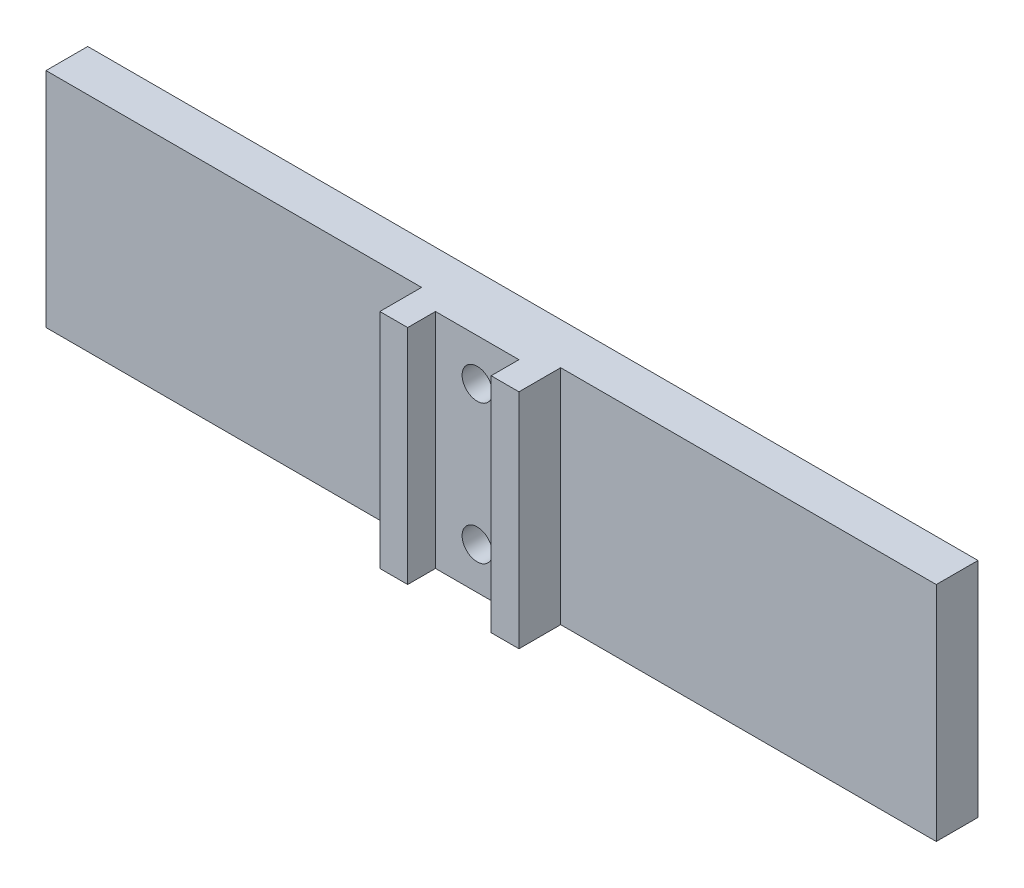
ISO-10303-21;
HEADER;
FILE_DESCRIPTION(('STEP AP214'),'2;1');
FILE_NAME('part.step','',(''),(''),'','','');
FILE_SCHEMA(('AUTOMOTIVE_DESIGN { 1 0 10303 214 1 1 1 1 }'));
ENDSEC;
DATA;
#1=APPLICATION_CONTEXT('core data for automotive mechanical design processes');
#2=APPLICATION_PROTOCOL_DEFINITION('international standard','automotive_design',2000,#1);
#3=PRODUCT_CONTEXT('',#1,'mechanical');
#4=PRODUCT('Part','Part','',(#3));
#5=PRODUCT_RELATED_PRODUCT_CATEGORY('part','',(#4));
#6=PRODUCT_DEFINITION_FORMATION('','',#4);
#7=PRODUCT_DEFINITION_CONTEXT('part definition',#1,'design');
#8=PRODUCT_DEFINITION('design','',#6,#7);
#9=PRODUCT_DEFINITION_SHAPE('','',#8);
#10=(LENGTH_UNIT() NAMED_UNIT(*) SI_UNIT(.MILLI.,.METRE.));
#11=(NAMED_UNIT(*) PLANE_ANGLE_UNIT() SI_UNIT($,.RADIAN.));
#12=(NAMED_UNIT(*) SI_UNIT($,.STERADIAN.) SOLID_ANGLE_UNIT());
#13=UNCERTAINTY_MEASURE_WITH_UNIT(LENGTH_MEASURE(1.E-05),#10,'distance_accuracy_value','');
#14=(GEOMETRIC_REPRESENTATION_CONTEXT(3) GLOBAL_UNCERTAINTY_ASSIGNED_CONTEXT((#13)) GLOBAL_UNIT_ASSIGNED_CONTEXT((#10,
#11,#12)) REPRESENTATION_CONTEXT('',''));
#15=CARTESIAN_POINT('',(0.,0.,0.));
#16=DIRECTION('',(0.,0.,1.));
#17=DIRECTION('',(1.,0.,0.));
#18=AXIS2_PLACEMENT_3D('',#15,#16,#17);
#19=CARTESIAN_POINT('',(0.,0.,9.525));
#20=DIRECTION('',(0.,0.,-1.));
#21=DIRECTION('',(-1.,0.,0.));
#22=AXIS2_PLACEMENT_3D('',#19,#20,#21);
#23=PLANE('',#22);
#24=DIRECTION('',(1.,0.,0.));
#25=VECTOR('',#24,1.);
#26=CARTESIAN_POINT('',(0.,0.,9.525));
#27=LINE('',#26,#25);
#28=CARTESIAN_POINT('',(42.8625,0.,9.525));
#29=VERTEX_POINT('',#28);
#30=CARTESIAN_POINT('',(46.0375,0.,9.52499999999999));
#31=VERTEX_POINT('',#30);
#32=EDGE_CURVE('E165',#29,#31,#27,.T.);
#33=ORIENTED_EDGE('',*,*,#32,.T.);
#34=DIRECTION('',(0.,1.,0.));
#35=VECTOR('',#34,1.);
#36=CARTESIAN_POINT('',(46.0375,0.,9.52499999999999));
#37=LINE('',#36,#35);
#38=CARTESIAN_POINT('',(46.0375,25.4,9.52499999999999));
#39=VERTEX_POINT('',#38);
#40=EDGE_CURVE('E187',#31,#39,#37,.T.);
#41=ORIENTED_EDGE('',*,*,#40,.T.);
#42=DIRECTION('',(-1.,0.,0.));
#43=VECTOR('',#42,1.);
#44=CARTESIAN_POINT('',(0.,25.4,9.525));
#45=LINE('',#44,#43);
#46=CARTESIAN_POINT('',(42.8625,25.4,9.525));
#47=VERTEX_POINT('',#46);
#48=EDGE_CURVE('E164',#39,#47,#45,.T.);
#49=ORIENTED_EDGE('',*,*,#48,.T.);
#50=DIRECTION('',(0.,1.,0.));
#51=VECTOR('',#50,1.);
#52=CARTESIAN_POINT('',(42.8625,0.,9.525));
#53=LINE('',#52,#51);
#54=EDGE_CURVE('E168',#29,#47,#53,.T.);
#55=ORIENTED_EDGE('',*,*,#54,.F.);
#56=EDGE_LOOP('',(#33,#41,#49,#55));
#57=FACE_BOUND('',#56,.T.);
#58=ADVANCED_FACE('F35',(#57),#23,.F.);
#59=CARTESIAN_POINT('',(0.,0.,9.525));
#60=DIRECTION('',(1.,0.,0.));
#61=DIRECTION('',(0.,0.,-1.));
#62=AXIS2_PLACEMENT_3D('',#59,#60,#61);
#63=PLANE('',#62);
#64=DIRECTION('',(0.,0.,-1.));
#65=VECTOR('',#64,1.);
#66=CARTESIAN_POINT('',(0.,0.,9.525));
#67=LINE('',#66,#65);
#68=CARTESIAN_POINT('',(0.,0.,4.76250000000001));
#69=VERTEX_POINT('',#68);
#70=CARTESIAN_POINT('',(0.,0.,0.));
#71=VERTEX_POINT('',#70);
#72=EDGE_CURVE('E11',#69,#71,#67,.T.);
#73=ORIENTED_EDGE('',*,*,#72,.F.);
#74=DIRECTION('',(0.,1.,0.));
#75=VECTOR('',#74,1.);
#76=CARTESIAN_POINT('',(0.,0.,4.76250000000001));
#77=LINE('',#76,#75);
#78=CARTESIAN_POINT('',(0.,25.4,4.76250000000001));
#79=VERTEX_POINT('',#78);
#80=EDGE_CURVE('E162',#69,#79,#77,.T.);
#81=ORIENTED_EDGE('',*,*,#80,.T.);
#82=DIRECTION('',(0.,0.,-1.));
#83=VECTOR('',#82,1.);
#84=CARTESIAN_POINT('',(0.,25.4,9.525));
#85=LINE('',#84,#83);
#86=CARTESIAN_POINT('',(0.,25.4,0.));
#87=VERTEX_POINT('',#86);
#88=EDGE_CURVE('E147',#79,#87,#85,.T.);
#89=ORIENTED_EDGE('',*,*,#88,.T.);
#90=DIRECTION('',(0.,-1.,0.));
#91=VECTOR('',#90,1.);
#92=CARTESIAN_POINT('',(0.,0.,0.));
#93=LINE('',#92,#91);
#94=EDGE_CURVE('E159',#87,#71,#93,.T.);
#95=ORIENTED_EDGE('',*,*,#94,.T.);
#96=EDGE_LOOP('',(#73,#81,#89,#95));
#97=FACE_BOUND('',#96,.T.);
#98=ADVANCED_FACE('F37',(#97),#63,.F.);
#99=CARTESIAN_POINT('',(0.,0.,9.525));
#100=DIRECTION('',(0.,1.,0.));
#101=DIRECTION('',(0.,0.,1.));
#102=AXIS2_PLACEMENT_3D('',#99,#100,#101);
#103=PLANE('',#102);
#104=DIRECTION('',(-1.,0.,0.));
#105=VECTOR('',#104,1.);
#106=CARTESIAN_POINT('',(101.6,0.,4.7625));
#107=LINE('',#106,#105);
#108=CARTESIAN_POINT('',(101.6,0.,4.7625));
#109=VERTEX_POINT('',#108);
#110=CARTESIAN_POINT('',(58.7375,0.,4.76250000000001));
#111=VERTEX_POINT('',#110);
#112=EDGE_CURVE('E123',#109,#111,#107,.T.);
#113=ORIENTED_EDGE('',*,*,#112,.T.);
#114=DIRECTION('',(0.,0.,1.));
#115=VECTOR('',#114,1.);
#116=CARTESIAN_POINT('',(58.7375,0.,9.525));
#117=LINE('',#116,#115);
#118=CARTESIAN_POINT('',(58.7375,0.,9.525));
#119=VERTEX_POINT('',#118);
#120=EDGE_CURVE('E134',#111,#119,#117,.T.);
#121=ORIENTED_EDGE('',*,*,#120,.T.);
#122=CARTESIAN_POINT('',(55.5625,0.,9.525));
#123=VERTEX_POINT('',#122);
#124=EDGE_CURVE('E155',#123,#119,#27,.T.);
#125=ORIENTED_EDGE('',*,*,#124,.F.);
#126=DIRECTION('',(0.,0.,-1.));
#127=VECTOR('',#126,1.);
#128=CARTESIAN_POINT('',(55.5625,0.,9.52499999999999));
#129=LINE('',#128,#127);
#130=CARTESIAN_POINT('',(55.5625,0.,6.35000000000001));
#131=VERTEX_POINT('',#130);
#132=EDGE_CURVE('E58',#123,#131,#129,.T.);
#133=ORIENTED_EDGE('',*,*,#132,.T.);
#134=DIRECTION('',(-1.,0.,0.));
#135=VECTOR('',#134,1.);
#136=CARTESIAN_POINT('',(55.5625,0.,6.35000000000001));
#137=LINE('',#136,#135);
#138=CARTESIAN_POINT('',(46.0375,0.,6.35000000000001));
#139=VERTEX_POINT('',#138);
#140=EDGE_CURVE('E191',#131,#139,#137,.T.);
#141=ORIENTED_EDGE('',*,*,#140,.T.);
#142=DIRECTION('',(0.,0.,1.));
#143=VECTOR('',#142,1.);
#144=CARTESIAN_POINT('',(46.0375,0.,9.52499999999999));
#145=LINE('',#144,#143);
#146=EDGE_CURVE('E199',#139,#31,#145,.T.);
#147=ORIENTED_EDGE('',*,*,#146,.T.);
#148=ORIENTED_EDGE('',*,*,#32,.F.);
#149=DIRECTION('',(0.,0.,-1.));
#150=VECTOR('',#149,1.);
#151=CARTESIAN_POINT('',(42.8625,0.,9.525));
#152=LINE('',#151,#150);
#153=CARTESIAN_POINT('',(42.8625,0.,4.76250000000001));
#154=VERTEX_POINT('',#153);
#155=EDGE_CURVE('E178',#29,#154,#152,.T.);
#156=ORIENTED_EDGE('',*,*,#155,.T.);
#157=DIRECTION('',(-1.,0.,0.));
#158=VECTOR('',#157,1.);
#159=CARTESIAN_POINT('',(0.,0.,4.76250000000001));
#160=LINE('',#159,#158);
#161=EDGE_CURVE('E172',#154,#69,#160,.T.);
#162=ORIENTED_EDGE('',*,*,#161,.T.);
#163=ORIENTED_EDGE('',*,*,#72,.T.);
#164=DIRECTION('',(1.,0.,0.));
#165=VECTOR('',#164,1.);
#166=CARTESIAN_POINT('',(0.,0.,0.));
#167=LINE('',#166,#165);
#168=CARTESIAN_POINT('',(101.6,0.,0.));
#169=VERTEX_POINT('',#168);
#170=EDGE_CURVE('E145',#71,#169,#167,.T.);
#171=ORIENTED_EDGE('',*,*,#170,.T.);
#172=DIRECTION('',(0.,0.,-1.));
#173=VECTOR('',#172,1.);
#174=CARTESIAN_POINT('',(101.6,0.,9.525));
#175=LINE('',#174,#173);
#176=EDGE_CURVE('E43',#109,#169,#175,.T.);
#177=ORIENTED_EDGE('',*,*,#176,.F.);
#178=EDGE_LOOP('',(#113,#121,#125,#133,#141,#147,#148,#156,#162,#163,#171,#177));
#179=FACE_BOUND('',#178,.T.);
#180=ADVANCED_FACE('F143',(#179),#103,.F.);
#181=CARTESIAN_POINT('',(101.6,0.,9.525));
#182=DIRECTION('',(-1.,0.,0.));
#183=DIRECTION('',(0.,0.,1.));
#184=AXIS2_PLACEMENT_3D('',#181,#182,#183);
#185=PLANE('',#184);
#186=DIRECTION('',(0.,0.,-1.));
#187=VECTOR('',#186,1.);
#188=CARTESIAN_POINT('',(101.6,25.4,9.525));
#189=LINE('',#188,#187);
#190=CARTESIAN_POINT('',(101.6,25.4,4.7625));
#191=VERTEX_POINT('',#190);
#192=CARTESIAN_POINT('',(101.6,25.4,0.));
#193=VERTEX_POINT('',#192);
#194=EDGE_CURVE('E141',#191,#193,#189,.T.);
#195=ORIENTED_EDGE('',*,*,#194,.F.);
#196=DIRECTION('',(0.,1.,0.));
#197=VECTOR('',#196,1.);
#198=CARTESIAN_POINT('',(101.6,0.,4.7625));
#199=LINE('',#198,#197);
#200=EDGE_CURVE('E127',#109,#191,#199,.T.);
#201=ORIENTED_EDGE('',*,*,#200,.F.);
#202=ORIENTED_EDGE('',*,*,#176,.T.);
#203=DIRECTION('',(0.,1.,0.));
#204=VECTOR('',#203,1.);
#205=CARTESIAN_POINT('',(101.6,0.,0.));
#206=LINE('',#205,#204);
#207=EDGE_CURVE('E156',#169,#193,#206,.T.);
#208=ORIENTED_EDGE('',*,*,#207,.T.);
#209=EDGE_LOOP('',(#195,#201,#202,#208));
#210=FACE_BOUND('',#209,.T.);
#211=ADVANCED_FACE('F138',(#210),#185,.F.);
#212=CARTESIAN_POINT('',(0.,25.4,9.525));
#213=DIRECTION('',(0.,-1.,0.));
#214=DIRECTION('',(0.,0.,-1.));
#215=AXIS2_PLACEMENT_3D('',#212,#213,#214);
#216=PLANE('',#215);
#217=CARTESIAN_POINT('',(58.7375,25.4,9.525));
#218=VERTEX_POINT('',#217);
#219=CARTESIAN_POINT('',(55.5625,25.4,9.52499999999999));
#220=VERTEX_POINT('',#219);
#221=EDGE_CURVE('E151',#218,#220,#45,.T.);
#222=ORIENTED_EDGE('',*,*,#221,.F.);
#223=DIRECTION('',(0.,0.,1.));
#224=VECTOR('',#223,1.);
#225=CARTESIAN_POINT('',(58.7375,25.4,9.525));
#226=LINE('',#225,#224);
#227=CARTESIAN_POINT('',(58.7375,25.4,4.76250000000001));
#228=VERTEX_POINT('',#227);
#229=EDGE_CURVE('E50',#228,#218,#226,.T.);
#230=ORIENTED_EDGE('',*,*,#229,.F.);
#231=DIRECTION('',(-1.,0.,0.));
#232=VECTOR('',#231,1.);
#233=CARTESIAN_POINT('',(101.6,25.4,4.7625));
#234=LINE('',#233,#232);
#235=EDGE_CURVE('E214',#191,#228,#234,.T.);
#236=ORIENTED_EDGE('',*,*,#235,.F.);
#237=ORIENTED_EDGE('',*,*,#194,.T.);
#238=DIRECTION('',(-1.,0.,0.));
#239=VECTOR('',#238,1.);
#240=CARTESIAN_POINT('',(0.,25.4,0.));
#241=LINE('',#240,#239);
#242=EDGE_CURVE('E152',#193,#87,#241,.T.);
#243=ORIENTED_EDGE('',*,*,#242,.T.);
#244=ORIENTED_EDGE('',*,*,#88,.F.);
#245=DIRECTION('',(-1.,0.,0.));
#246=VECTOR('',#245,1.);
#247=CARTESIAN_POINT('',(0.,25.4,4.76250000000001));
#248=LINE('',#247,#246);
#249=CARTESIAN_POINT('',(42.8625,25.4,4.76250000000001));
#250=VERTEX_POINT('',#249);
#251=EDGE_CURVE('E176',#250,#79,#248,.T.);
#252=ORIENTED_EDGE('',*,*,#251,.F.);
#253=DIRECTION('',(0.,0.,-1.));
#254=VECTOR('',#253,1.);
#255=CARTESIAN_POINT('',(42.8625,25.4,9.525));
#256=LINE('',#255,#254);
#257=EDGE_CURVE('E179',#47,#250,#256,.T.);
#258=ORIENTED_EDGE('',*,*,#257,.F.);
#259=ORIENTED_EDGE('',*,*,#48,.F.);
#260=DIRECTION('',(0.,0.,1.));
#261=VECTOR('',#260,1.);
#262=CARTESIAN_POINT('',(46.0375,25.4,9.52499999999999));
#263=LINE('',#262,#261);
#264=CARTESIAN_POINT('',(46.0375,25.4,6.35000000000001));
#265=VERTEX_POINT('',#264);
#266=EDGE_CURVE('E203',#265,#39,#263,.T.);
#267=ORIENTED_EDGE('',*,*,#266,.F.);
#268=DIRECTION('',(-1.,0.,0.));
#269=VECTOR('',#268,1.);
#270=CARTESIAN_POINT('',(55.5625,25.4,6.35000000000001));
#271=LINE('',#270,#269);
#272=CARTESIAN_POINT('',(55.5625,25.4,6.35000000000001));
#273=VERTEX_POINT('',#272);
#274=EDGE_CURVE('E196',#273,#265,#271,.T.);
#275=ORIENTED_EDGE('',*,*,#274,.F.);
#276=DIRECTION('',(0.,0.,-1.));
#277=VECTOR('',#276,1.);
#278=CARTESIAN_POINT('',(55.5625,25.4,9.52499999999999));
#279=LINE('',#278,#277);
#280=EDGE_CURVE('E200',#220,#273,#279,.T.);
#281=ORIENTED_EDGE('',*,*,#280,.F.);
#282=EDGE_LOOP('',(#222,#230,#236,#237,#243,#244,#252,#258,#259,#267,#275,#281));
#283=FACE_BOUND('',#282,.T.);
#284=ADVANCED_FACE('F248',(#283),#216,.F.);
#285=ORIENTED_EDGE('',*,*,#124,.T.);
#286=DIRECTION('',(0.,1.,0.));
#287=VECTOR('',#286,1.);
#288=CARTESIAN_POINT('',(58.7375,0.,9.525));
#289=LINE('',#288,#287);
#290=EDGE_CURVE('E205',#119,#218,#289,.T.);
#291=ORIENTED_EDGE('',*,*,#290,.T.);
#292=ORIENTED_EDGE('',*,*,#221,.T.);
#293=DIRECTION('',(0.,1.,0.));
#294=VECTOR('',#293,1.);
#295=CARTESIAN_POINT('',(55.5625,0.,9.52499999999999));
#296=LINE('',#295,#294);
#297=EDGE_CURVE('E190',#123,#220,#296,.T.);
#298=ORIENTED_EDGE('',*,*,#297,.F.);
#299=EDGE_LOOP('',(#285,#291,#292,#298));
#300=FACE_BOUND('',#299,.T.);
#301=ADVANCED_FACE('F257',(#300),#23,.F.);
#302=CARTESIAN_POINT('',(0.,0.,0.));
#303=DIRECTION('',(0.,0.,-1.));
#304=DIRECTION('',(-1.,0.,0.));
#305=AXIS2_PLACEMENT_3D('',#302,#303,#304);
#306=PLANE('',#305);
#307=CARTESIAN_POINT('',(50.8,4.7625,0.));
#308=DIRECTION('',(0.,0.,1.));
#309=DIRECTION('',(1.,0.,0.));
#310=AXIS2_PLACEMENT_3D('',#307,#308,#309);
#311=CIRCLE('',#310,1.7272);
#312=CARTESIAN_POINT('',(52.5272,4.7625,0.));
#313=VERTEX_POINT('',#312);
#314=EDGE_CURVE('E223',#313,#313,#311,.T.);
#315=ORIENTED_EDGE('',*,*,#314,.T.);
#316=EDGE_LOOP('',(#315));
#317=FACE_BOUND('',#316,.T.);
#318=CARTESIAN_POINT('',(50.8,20.6375,0.));
#319=DIRECTION('',(0.,0.,1.));
#320=DIRECTION('',(1.,0.,0.));
#321=AXIS2_PLACEMENT_3D('',#318,#319,#320);
#322=CIRCLE('',#321,1.7272);
#323=CARTESIAN_POINT('',(52.5272,20.6375,0.));
#324=VERTEX_POINT('',#323);
#325=EDGE_CURVE('E216',#324,#324,#322,.T.);
#326=ORIENTED_EDGE('',*,*,#325,.T.);
#327=EDGE_LOOP('',(#326));
#328=FACE_BOUND('',#327,.T.);
#329=ORIENTED_EDGE('',*,*,#94,.F.);
#330=ORIENTED_EDGE('',*,*,#242,.F.);
#331=ORIENTED_EDGE('',*,*,#207,.F.);
#332=ORIENTED_EDGE('',*,*,#170,.F.);
#333=EDGE_LOOP('',(#329,#330,#331,#332));
#334=FACE_BOUND('',#333,.T.);
#335=ADVANCED_FACE('F262',(#317,#328,#334),#306,.T.);
#336=CARTESIAN_POINT('',(0.,0.,4.76250000000001));
#337=DIRECTION('',(0.,0.,-1.));
#338=DIRECTION('',(-1.,0.,0.));
#339=AXIS2_PLACEMENT_3D('',#336,#337,#338);
#340=PLANE('',#339);
#341=ORIENTED_EDGE('',*,*,#251,.T.);
#342=ORIENTED_EDGE('',*,*,#80,.F.);
#343=ORIENTED_EDGE('',*,*,#161,.F.);
#344=DIRECTION('',(0.,1.,0.));
#345=VECTOR('',#344,1.);
#346=CARTESIAN_POINT('',(42.8625,0.,4.76250000000001));
#347=LINE('',#346,#345);
#348=EDGE_CURVE('E171',#154,#250,#347,.T.);
#349=ORIENTED_EDGE('',*,*,#348,.T.);
#350=EDGE_LOOP('',(#341,#342,#343,#349));
#351=FACE_BOUND('',#350,.T.);
#352=ADVANCED_FACE('F267',(#351),#340,.F.);
#353=CARTESIAN_POINT('',(42.8625,0.,9.525));
#354=DIRECTION('',(1.,0.,0.));
#355=DIRECTION('',(0.,0.,-1.));
#356=AXIS2_PLACEMENT_3D('',#353,#354,#355);
#357=PLANE('',#356);
#358=ORIENTED_EDGE('',*,*,#257,.T.);
#359=ORIENTED_EDGE('',*,*,#348,.F.);
#360=ORIENTED_EDGE('',*,*,#155,.F.);
#361=ORIENTED_EDGE('',*,*,#54,.T.);
#362=EDGE_LOOP('',(#358,#359,#360,#361));
#363=FACE_BOUND('',#362,.T.);
#364=ADVANCED_FACE('F270',(#363),#357,.F.);
#365=CARTESIAN_POINT('',(46.0375,0.,9.52499999999999));
#366=DIRECTION('',(-1.,0.,0.));
#367=DIRECTION('',(0.,0.,1.));
#368=AXIS2_PLACEMENT_3D('',#365,#366,#367);
#369=PLANE('',#368);
#370=ORIENTED_EDGE('',*,*,#266,.T.);
#371=ORIENTED_EDGE('',*,*,#40,.F.);
#372=ORIENTED_EDGE('',*,*,#146,.F.);
#373=DIRECTION('',(0.,1.,0.));
#374=VECTOR('',#373,1.);
#375=CARTESIAN_POINT('',(46.0375,0.,6.35000000000001));
#376=LINE('',#375,#374);
#377=EDGE_CURVE('E182',#139,#265,#376,.T.);
#378=ORIENTED_EDGE('',*,*,#377,.T.);
#379=EDGE_LOOP('',(#370,#371,#372,#378));
#380=FACE_BOUND('',#379,.T.);
#381=ADVANCED_FACE('F236',(#380),#369,.F.);
#382=CARTESIAN_POINT('',(55.5625,0.,6.35000000000001));
#383=DIRECTION('',(0.,0.,-1.));
#384=DIRECTION('',(-1.,0.,0.));
#385=AXIS2_PLACEMENT_3D('',#382,#383,#384);
#386=PLANE('',#385);
#387=CARTESIAN_POINT('',(50.8,4.7625,6.35000000000001));
#388=DIRECTION('',(0.,0.,1.));
#389=DIRECTION('',(1.,0.,0.));
#390=AXIS2_PLACEMENT_3D('',#387,#388,#389);
#391=CIRCLE('',#390,1.72719999999998);
#392=CARTESIAN_POINT('',(52.5272,4.7625,6.35000000000001));
#393=VERTEX_POINT('',#392);
#394=EDGE_CURVE('E226',#393,#393,#391,.T.);
#395=ORIENTED_EDGE('',*,*,#394,.F.);
#396=EDGE_LOOP('',(#395));
#397=FACE_BOUND('',#396,.T.);
#398=CARTESIAN_POINT('',(50.8,20.6375,6.35000000000001));
#399=DIRECTION('',(0.,0.,1.));
#400=DIRECTION('',(1.,0.,0.));
#401=AXIS2_PLACEMENT_3D('',#398,#399,#400);
#402=CIRCLE('',#401,1.72719999999998);
#403=CARTESIAN_POINT('',(52.5272,20.6375,6.35000000000001));
#404=VERTEX_POINT('',#403);
#405=EDGE_CURVE('E220',#404,#404,#402,.T.);
#406=ORIENTED_EDGE('',*,*,#405,.F.);
#407=EDGE_LOOP('',(#406));
#408=FACE_BOUND('',#407,.T.);
#409=ORIENTED_EDGE('',*,*,#274,.T.);
#410=ORIENTED_EDGE('',*,*,#377,.F.);
#411=ORIENTED_EDGE('',*,*,#140,.F.);
#412=DIRECTION('',(0.,1.,0.));
#413=VECTOR('',#412,1.);
#414=CARTESIAN_POINT('',(55.5625,0.,6.35000000000001));
#415=LINE('',#414,#413);
#416=EDGE_CURVE('E193',#131,#273,#415,.T.);
#417=ORIENTED_EDGE('',*,*,#416,.T.);
#418=EDGE_LOOP('',(#409,#410,#411,#417));
#419=FACE_BOUND('',#418,.T.);
#420=ADVANCED_FACE('F232',(#397,#408,#419),#386,.F.);
#421=CARTESIAN_POINT('',(55.5625,0.,9.52499999999999));
#422=DIRECTION('',(1.,0.,0.));
#423=DIRECTION('',(0.,0.,-1.));
#424=AXIS2_PLACEMENT_3D('',#421,#422,#423);
#425=PLANE('',#424);
#426=ORIENTED_EDGE('',*,*,#280,.T.);
#427=ORIENTED_EDGE('',*,*,#416,.F.);
#428=ORIENTED_EDGE('',*,*,#132,.F.);
#429=ORIENTED_EDGE('',*,*,#297,.T.);
#430=EDGE_LOOP('',(#426,#427,#428,#429));
#431=FACE_BOUND('',#430,.T.);
#432=ADVANCED_FACE('F235',(#431),#425,.F.);
#433=CARTESIAN_POINT('',(58.7375,0.,9.525));
#434=DIRECTION('',(-1.,0.,0.));
#435=DIRECTION('',(0.,0.,1.));
#436=AXIS2_PLACEMENT_3D('',#433,#434,#435);
#437=PLANE('',#436);
#438=ORIENTED_EDGE('',*,*,#229,.T.);
#439=ORIENTED_EDGE('',*,*,#290,.F.);
#440=ORIENTED_EDGE('',*,*,#120,.F.);
#441=DIRECTION('',(0.,1.,0.));
#442=VECTOR('',#441,1.);
#443=CARTESIAN_POINT('',(58.7375,0.,4.76250000000001));
#444=LINE('',#443,#442);
#445=EDGE_CURVE('E129',#111,#228,#444,.T.);
#446=ORIENTED_EDGE('',*,*,#445,.T.);
#447=EDGE_LOOP('',(#438,#439,#440,#446));
#448=FACE_BOUND('',#447,.T.);
#449=ADVANCED_FACE('F341',(#448),#437,.F.);
#450=CARTESIAN_POINT('',(101.6,0.,4.7625));
#451=DIRECTION('',(0.,0.,-1.));
#452=DIRECTION('',(-1.,0.,0.));
#453=AXIS2_PLACEMENT_3D('',#450,#451,#452);
#454=PLANE('',#453);
#455=ORIENTED_EDGE('',*,*,#235,.T.);
#456=ORIENTED_EDGE('',*,*,#445,.F.);
#457=ORIENTED_EDGE('',*,*,#112,.F.);
#458=ORIENTED_EDGE('',*,*,#200,.T.);
#459=EDGE_LOOP('',(#455,#456,#457,#458));
#460=FACE_BOUND('',#459,.T.);
#461=ADVANCED_FACE('F126',(#460),#454,.F.);
#462=CARTESIAN_POINT('',(50.8,20.6375,6.35000000000001));
#463=DIRECTION('',(0.,0.,1.));
#464=DIRECTION('',(1.,0.,0.));
#465=AXIS2_PLACEMENT_3D('',#462,#463,#464);
#466=CYLINDRICAL_SURFACE('',#465,1.72719999999999);
#467=ORIENTED_EDGE('',*,*,#325,.F.);
#468=EDGE_LOOP('',(#467));
#469=FACE_BOUND('',#468,.T.);
#470=ORIENTED_EDGE('',*,*,#405,.T.);
#471=EDGE_LOOP('',(#470));
#472=FACE_BOUND('',#471,.T.);
#473=ADVANCED_FACE('F358',(#469,#472),#466,.F.);
#474=CARTESIAN_POINT('',(50.8,4.7625,6.35000000000001));
#475=DIRECTION('',(0.,0.,1.));
#476=DIRECTION('',(1.,0.,0.));
#477=AXIS2_PLACEMENT_3D('',#474,#475,#476);
#478=CYLINDRICAL_SURFACE('',#477,1.72719999999999);
#479=ORIENTED_EDGE('',*,*,#314,.F.);
#480=EDGE_LOOP('',(#479));
#481=FACE_BOUND('',#480,.T.);
#482=ORIENTED_EDGE('',*,*,#394,.T.);
#483=EDGE_LOOP('',(#482));
#484=FACE_BOUND('',#483,.T.);
#485=ADVANCED_FACE('F230',(#481,#484),#478,.F.);
#486=CLOSED_SHELL('',(#58,#98,#180,#211,#284,#301,#335,#352,#364,#381,#420,#432,#449,#461,#473,#485));
#487=MANIFOLD_SOLID_BREP('B2',#486);
#488=ADVANCED_BREP_SHAPE_REPRESENTATION('',(#18,#487),#14);
#489=SHAPE_DEFINITION_REPRESENTATION(#9,#488);
ENDSEC;
END-ISO-10303-21;
